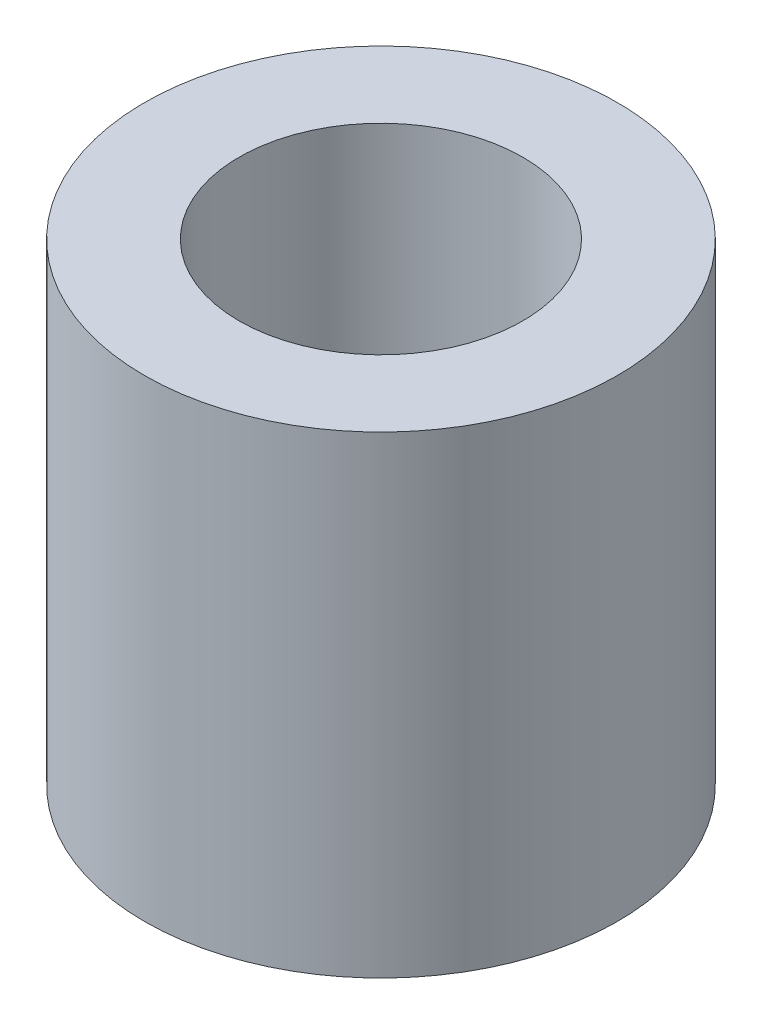
ISO-10303-21;
HEADER;
FILE_DESCRIPTION(('STEP AP214'),'2;1');
FILE_NAME('part.step','',(''),(''),'','','');
FILE_SCHEMA(('AUTOMOTIVE_DESIGN { 1 0 10303 214 1 1 1 1 }'));
ENDSEC;
DATA;
#1=APPLICATION_CONTEXT('core data for automotive mechanical design processes');
#2=APPLICATION_PROTOCOL_DEFINITION('international standard','automotive_design',2000,#1);
#3=PRODUCT_CONTEXT('',#1,'mechanical');
#4=PRODUCT('Part','Part','',(#3));
#5=PRODUCT_RELATED_PRODUCT_CATEGORY('part','',(#4));
#6=PRODUCT_DEFINITION_FORMATION('','',#4);
#7=PRODUCT_DEFINITION_CONTEXT('part definition',#1,'design');
#8=PRODUCT_DEFINITION('design','',#6,#7);
#9=PRODUCT_DEFINITION_SHAPE('','',#8);
#10=(LENGTH_UNIT() NAMED_UNIT(*) SI_UNIT(.MILLI.,.METRE.));
#11=(NAMED_UNIT(*) PLANE_ANGLE_UNIT() SI_UNIT($,.RADIAN.));
#12=(NAMED_UNIT(*) SI_UNIT($,.STERADIAN.) SOLID_ANGLE_UNIT());
#13=UNCERTAINTY_MEASURE_WITH_UNIT(LENGTH_MEASURE(1.E-05),#10,'distance_accuracy_value','');
#14=(GEOMETRIC_REPRESENTATION_CONTEXT(3) GLOBAL_UNCERTAINTY_ASSIGNED_CONTEXT((#13)) GLOBAL_UNIT_ASSIGNED_CONTEXT((#10,
#11,#12)) REPRESENTATION_CONTEXT('',''));
#15=CARTESIAN_POINT('',(0.,0.,0.));
#16=DIRECTION('',(0.,0.,1.));
#17=DIRECTION('',(1.,0.,0.));
#18=AXIS2_PLACEMENT_3D('',#15,#16,#17);
#19=CARTESIAN_POINT('',(0.,5.,0.));
#20=DIRECTION('',(0.,1.,0.));
#21=DIRECTION('',(0.,0.,1.));
#22=AXIS2_PLACEMENT_3D('',#19,#20,#21);
#23=PLANE('',#22);
#24=CARTESIAN_POINT('',(0.,5.,0.));
#25=DIRECTION('',(0.,1.,0.));
#26=DIRECTION('',(0.,0.,1.));
#27=AXIS2_PLACEMENT_3D('',#24,#25,#26);
#28=CIRCLE('',#27,2.5);
#29=CARTESIAN_POINT('',(0.,5.,2.5));
#30=VERTEX_POINT('',#29);
#31=EDGE_CURVE('E10',#30,#30,#28,.T.);
#32=ORIENTED_EDGE('',*,*,#31,.T.);
#33=EDGE_LOOP('',(#32));
#34=FACE_BOUND('',#33,.T.);
#35=CARTESIAN_POINT('',(0.,5.,0.));
#36=DIRECTION('',(0.,1.,0.));
#37=DIRECTION('',(0.,0.,1.));
#38=AXIS2_PLACEMENT_3D('',#35,#36,#37);
#39=CIRCLE('',#38,1.5);
#40=CARTESIAN_POINT('',(0.,5.,1.5));
#41=VERTEX_POINT('',#40);
#42=EDGE_CURVE('E56',#41,#41,#39,.T.);
#43=ORIENTED_EDGE('',*,*,#42,.F.);
#44=EDGE_LOOP('',(#43));
#45=FACE_BOUND('',#44,.T.);
#46=ADVANCED_FACE('F43',(#34,#45),#23,.T.);
#47=CARTESIAN_POINT('',(0.,0.,0.));
#48=DIRECTION('',(0.,1.,0.));
#49=DIRECTION('',(0.,0.,1.));
#50=AXIS2_PLACEMENT_3D('',#47,#48,#49);
#51=PLANE('',#50);
#52=CARTESIAN_POINT('',(0.,0.,0.));
#53=DIRECTION('',(0.,1.,0.));
#54=DIRECTION('',(0.,0.,1.));
#55=AXIS2_PLACEMENT_3D('',#52,#53,#54);
#56=CIRCLE('',#55,2.5);
#57=CARTESIAN_POINT('',(0.,0.,2.5));
#58=VERTEX_POINT('',#57);
#59=EDGE_CURVE('E47',#58,#58,#56,.T.);
#60=ORIENTED_EDGE('',*,*,#59,.F.);
#61=EDGE_LOOP('',(#60));
#62=FACE_BOUND('',#61,.T.);
#63=CARTESIAN_POINT('',(0.,0.,0.));
#64=DIRECTION('',(0.,1.,0.));
#65=DIRECTION('',(0.,0.,1.));
#66=AXIS2_PLACEMENT_3D('',#63,#64,#65);
#67=CIRCLE('',#66,1.5);
#68=CARTESIAN_POINT('',(0.,0.,1.5));
#69=VERTEX_POINT('',#68);
#70=EDGE_CURVE('E58',#69,#69,#67,.T.);
#71=ORIENTED_EDGE('',*,*,#70,.T.);
#72=EDGE_LOOP('',(#71));
#73=FACE_BOUND('',#72,.T.);
#74=ADVANCED_FACE('F70',(#62,#73),#51,.F.);
#75=CARTESIAN_POINT('',(0.,5.,0.));
#76=DIRECTION('',(0.,-1.,0.));
#77=DIRECTION('',(0.,0.,-1.));
#78=AXIS2_PLACEMENT_3D('',#75,#76,#77);
#79=CYLINDRICAL_SURFACE('',#78,2.5);
#80=ORIENTED_EDGE('',*,*,#31,.F.);
#81=EDGE_LOOP('',(#80));
#82=FACE_BOUND('',#81,.T.);
#83=ORIENTED_EDGE('',*,*,#59,.T.);
#84=EDGE_LOOP('',(#83));
#85=FACE_BOUND('',#84,.T.);
#86=ADVANCED_FACE('F45',(#82,#85),#79,.T.);
#87=CARTESIAN_POINT('',(0.,5.,0.));
#88=DIRECTION('',(0.,-1.,0.));
#89=DIRECTION('',(0.,0.,-1.));
#90=AXIS2_PLACEMENT_3D('',#87,#88,#89);
#91=CYLINDRICAL_SURFACE('',#90,1.5);
#92=ORIENTED_EDGE('',*,*,#42,.T.);
#93=EDGE_LOOP('',(#92));
#94=FACE_BOUND('',#93,.T.);
#95=ORIENTED_EDGE('',*,*,#70,.F.);
#96=EDGE_LOOP('',(#95));
#97=FACE_BOUND('',#96,.T.);
#98=ADVANCED_FACE('F66',(#94,#97),#91,.F.);
#99=CLOSED_SHELL('',(#46,#74,#86,#98));
#100=MANIFOLD_SOLID_BREP('B2',#99);
#101=ADVANCED_BREP_SHAPE_REPRESENTATION('',(#18,#100),#14);
#102=SHAPE_DEFINITION_REPRESENTATION(#9,#101);
ENDSEC;
END-ISO-10303-21;
